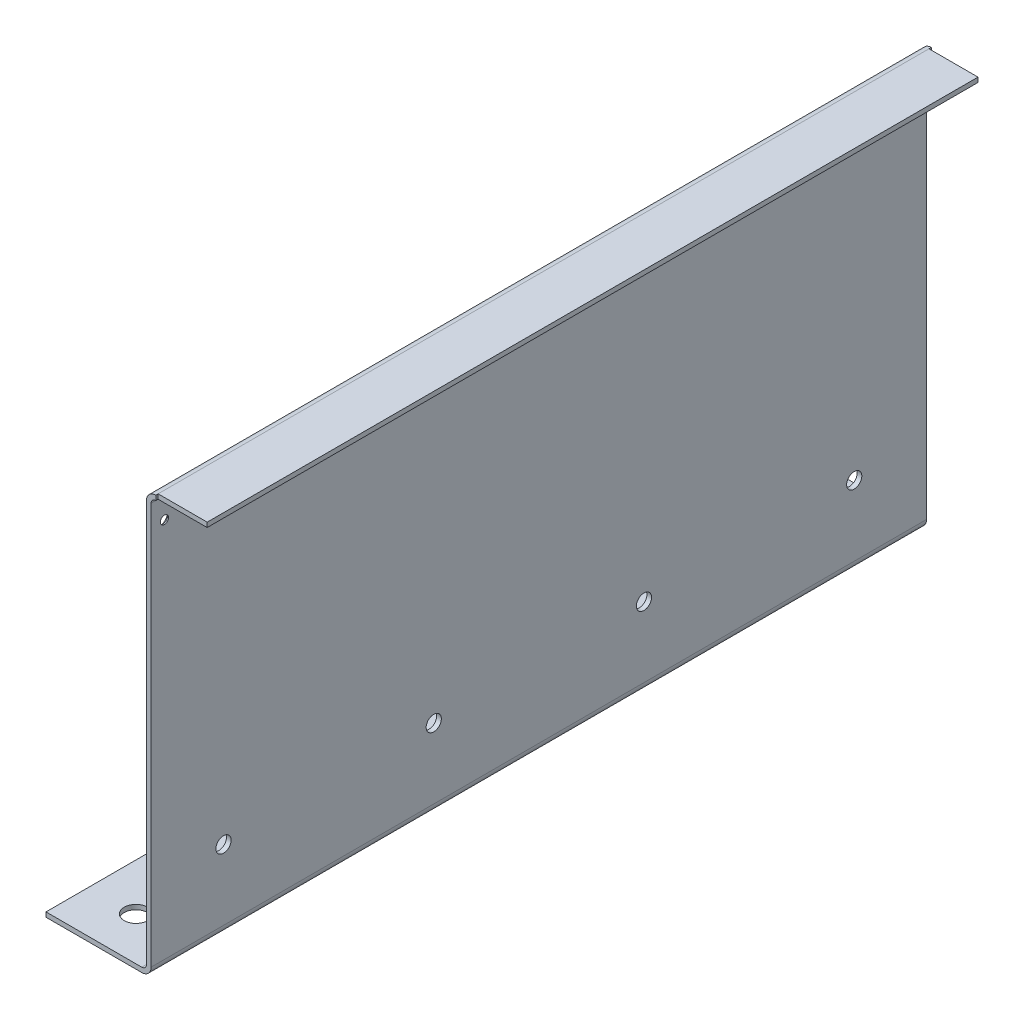
ISO-10303-21;
HEADER;
FILE_DESCRIPTION(('STEP AP214'),'2;1');
FILE_NAME('part.step','',(''),(''),'','','');
FILE_SCHEMA(('AUTOMOTIVE_DESIGN { 1 0 10303 214 1 1 1 1 }'));
ENDSEC;
DATA;
#1=APPLICATION_CONTEXT('core data for automotive mechanical design processes');
#2=APPLICATION_PROTOCOL_DEFINITION('international standard','automotive_design',2000,#1);
#3=PRODUCT_CONTEXT('',#1,'mechanical');
#4=PRODUCT('Part','Part','',(#3));
#5=PRODUCT_RELATED_PRODUCT_CATEGORY('part','',(#4));
#6=PRODUCT_DEFINITION_FORMATION('','',#4);
#7=PRODUCT_DEFINITION_CONTEXT('part definition',#1,'design');
#8=PRODUCT_DEFINITION('design','',#6,#7);
#9=PRODUCT_DEFINITION_SHAPE('','',#8);
#10=(LENGTH_UNIT() NAMED_UNIT(*) SI_UNIT(.MILLI.,.METRE.));
#11=(NAMED_UNIT(*) PLANE_ANGLE_UNIT() SI_UNIT($,.RADIAN.));
#12=(NAMED_UNIT(*) SI_UNIT($,.STERADIAN.) SOLID_ANGLE_UNIT());
#13=UNCERTAINTY_MEASURE_WITH_UNIT(LENGTH_MEASURE(1.E-05),#10,'distance_accuracy_value','');
#14=(GEOMETRIC_REPRESENTATION_CONTEXT(3) GLOBAL_UNCERTAINTY_ASSIGNED_CONTEXT((#13)) GLOBAL_UNIT_ASSIGNED_CONTEXT((#10,
#11,#12)) REPRESENTATION_CONTEXT('',''));
#15=CARTESIAN_POINT('',(0.,0.,0.));
#16=DIRECTION('',(0.,0.,1.));
#17=DIRECTION('',(1.,0.,0.));
#18=AXIS2_PLACEMENT_3D('',#15,#16,#17);
#19=CARTESIAN_POINT('',(3.00000000000004,104.,332.));
#20=DIRECTION('',(0.,0.,-1.));
#21=DIRECTION('',(-1.,0.,0.));
#22=AXIS2_PLACEMENT_3D('',#19,#20,#21);
#23=CYLINDRICAL_SURFACE('',#22,2.);
#24=CARTESIAN_POINT('',(3.00000000000004,104.,0.));
#25=DIRECTION('',(0.,0.,-1.));
#26=DIRECTION('',(1.,0.,0.));
#27=AXIS2_PLACEMENT_3D('',#24,#25,#26);
#28=CIRCLE('',#27,2.);
#29=CARTESIAN_POINT('',(1.00000000000004,104.,0.));
#30=VERTEX_POINT('',#29);
#31=CARTESIAN_POINT('',(3.00000000000004,106.,0.));
#32=VERTEX_POINT('',#31);
#33=EDGE_CURVE('E140',#30,#32,#28,.T.);
#34=ORIENTED_EDGE('',*,*,#33,.T.);
#35=DIRECTION('',(0.,0.,1.));
#36=VECTOR('',#35,1.);
#37=CARTESIAN_POINT('',(2.99999999999996,106.,332.));
#38=LINE('',#37,#36);
#39=CARTESIAN_POINT('',(2.99999999999996,106.,1.));
#40=VERTEX_POINT('',#39);
#41=EDGE_CURVE('E466',#32,#40,#38,.T.);
#42=ORIENTED_EDGE('',*,*,#41,.T.);
#43=DIRECTION('',(0.,0.,-1.));
#44=VECTOR('',#43,1.);
#45=CARTESIAN_POINT('',(3.00000000000004,106.,332.));
#46=LINE('',#45,#44);
#47=CARTESIAN_POINT('',(2.99999999999991,106.,331.));
#48=VERTEX_POINT('',#47);
#49=EDGE_CURVE('E181',#48,#40,#46,.T.);
#50=ORIENTED_EDGE('',*,*,#49,.F.);
#51=CARTESIAN_POINT('',(2.99999999999991,106.,332.));
#52=VERTEX_POINT('',#51);
#53=EDGE_CURVE('E182',#52,#48,#46,.T.);
#54=ORIENTED_EDGE('',*,*,#53,.F.);
#55=CARTESIAN_POINT('',(3.00000000000004,104.,332.));
#56=DIRECTION('',(0.,0.,-1.));
#57=DIRECTION('',(1.,0.,0.));
#58=AXIS2_PLACEMENT_3D('',#55,#56,#57);
#59=CIRCLE('',#58,2.);
#60=CARTESIAN_POINT('',(1.00000000000004,104.,332.));
#61=VERTEX_POINT('',#60);
#62=EDGE_CURVE('E157',#61,#52,#59,.T.);
#63=ORIENTED_EDGE('',*,*,#62,.F.);
#64=DIRECTION('',(0.,0.,-1.));
#65=VECTOR('',#64,1.);
#66=CARTESIAN_POINT('',(1.00000000000004,104.,332.));
#67=LINE('',#66,#65);
#68=EDGE_CURVE('E136',#61,#30,#67,.T.);
#69=ORIENTED_EDGE('',*,*,#68,.T.);
#70=EDGE_LOOP('',(#34,#42,#50,#54,#63,#69));
#71=FACE_BOUND('',#70,.T.);
#72=ADVANCED_FACE('F31',(#71),#23,.F.);
#73=CARTESIAN_POINT('',(3.00000000000004,106.,332.));
#74=DIRECTION('',(0.,1.,0.));
#75=DIRECTION('',(0.,0.,1.));
#76=AXIS2_PLACEMENT_3D('',#73,#74,#75);
#77=PLANE('',#76);
#78=DIRECTION('',(0.,0.,-1.));
#79=VECTOR('',#78,1.);
#80=CARTESIAN_POINT('',(23.9999999999997,106.,332.));
#81=LINE('',#80,#79);
#82=CARTESIAN_POINT('',(23.9999999999997,106.,331.));
#83=VERTEX_POINT('',#82);
#84=CARTESIAN_POINT('',(23.9999999999997,106.,1.));
#85=VERTEX_POINT('',#84);
#86=EDGE_CURVE('E178',#83,#85,#81,.T.);
#87=ORIENTED_EDGE('',*,*,#86,.F.);
#88=DIRECTION('',(-1.,0.,0.));
#89=VECTOR('',#88,1.);
#90=CARTESIAN_POINT('',(3.00000000000004,106.,331.));
#91=LINE('',#90,#89);
#92=EDGE_CURVE('E478',#83,#48,#91,.T.);
#93=ORIENTED_EDGE('',*,*,#92,.T.);
#94=ORIENTED_EDGE('',*,*,#49,.T.);
#95=DIRECTION('',(1.,0.,0.));
#96=VECTOR('',#95,1.);
#97=CARTESIAN_POINT('',(3.00000000000003,106.,1.));
#98=LINE('',#97,#96);
#99=EDGE_CURVE('E460',#40,#85,#98,.T.);
#100=ORIENTED_EDGE('',*,*,#99,.T.);
#101=EDGE_LOOP('',(#87,#93,#94,#100));
#102=FACE_BOUND('',#101,.T.);
#103=ADVANCED_FACE('F275',(#102),#77,.F.);
#104=CARTESIAN_POINT('',(23.9999999999997,108.,332.));
#105=DIRECTION('',(-1.,0.,0.));
#106=DIRECTION('',(0.,0.,1.));
#107=AXIS2_PLACEMENT_3D('',#104,#105,#106);
#108=PLANE('',#107);
#109=DIRECTION('',(0.,0.,-1.));
#110=VECTOR('',#109,1.);
#111=CARTESIAN_POINT('',(23.9999999999997,108.,332.));
#112=LINE('',#111,#110);
#113=CARTESIAN_POINT('',(23.9999999999997,108.,331.));
#114=VERTEX_POINT('',#113);
#115=CARTESIAN_POINT('',(23.9999999999997,108.,1.));
#116=VERTEX_POINT('',#115);
#117=EDGE_CURVE('E175',#114,#116,#112,.T.);
#118=ORIENTED_EDGE('',*,*,#117,.F.);
#119=DIRECTION('',(0.,-1.,0.));
#120=VECTOR('',#119,1.);
#121=CARTESIAN_POINT('',(23.9999999999997,108.,331.));
#122=LINE('',#121,#120);
#123=EDGE_CURVE('E481',#114,#83,#122,.T.);
#124=ORIENTED_EDGE('',*,*,#123,.T.);
#125=ORIENTED_EDGE('',*,*,#86,.T.);
#126=DIRECTION('',(0.,1.,0.));
#127=VECTOR('',#126,1.);
#128=CARTESIAN_POINT('',(23.9999999999997,108.,1.));
#129=LINE('',#128,#127);
#130=EDGE_CURVE('E463',#85,#116,#129,.T.);
#131=ORIENTED_EDGE('',*,*,#130,.T.);
#132=EDGE_LOOP('',(#118,#124,#125,#131));
#133=FACE_BOUND('',#132,.T.);
#134=ADVANCED_FACE('F281',(#133),#108,.F.);
#135=CARTESIAN_POINT('',(2.99999999999996,108.,332.));
#136=DIRECTION('',(0.,-1.,0.));
#137=DIRECTION('',(0.,0.,-1.));
#138=AXIS2_PLACEMENT_3D('',#135,#136,#137);
#139=PLANE('',#138);
#140=DIRECTION('',(0.,0.,-1.));
#141=VECTOR('',#140,1.);
#142=CARTESIAN_POINT('',(2.99999999999996,108.,332.));
#143=LINE('',#142,#141);
#144=CARTESIAN_POINT('',(2.99999999999991,108.,331.));
#145=VERTEX_POINT('',#144);
#146=CARTESIAN_POINT('',(2.99999999999996,108.,1.));
#147=VERTEX_POINT('',#146);
#148=EDGE_CURVE('E173',#145,#147,#143,.T.);
#149=ORIENTED_EDGE('',*,*,#148,.F.);
#150=DIRECTION('',(-1.,0.,0.));
#151=VECTOR('',#150,1.);
#152=CARTESIAN_POINT('',(2.99999999999991,108.,331.));
#153=LINE('',#152,#151);
#154=EDGE_CURVE('E217',#114,#145,#153,.T.);
#155=ORIENTED_EDGE('',*,*,#154,.F.);
#156=ORIENTED_EDGE('',*,*,#117,.T.);
#157=DIRECTION('',(1.,0.,0.));
#158=VECTOR('',#157,1.);
#159=CARTESIAN_POINT('',(2.99999999999996,108.,1.));
#160=LINE('',#159,#158);
#161=EDGE_CURVE('E472',#147,#116,#160,.T.);
#162=ORIENTED_EDGE('',*,*,#161,.F.);
#163=EDGE_LOOP('',(#149,#155,#156,#162));
#164=FACE_BOUND('',#163,.T.);
#165=ADVANCED_FACE('F287',(#164),#139,.F.);
#166=CARTESIAN_POINT('',(2.99999999999996,104.,332.));
#167=DIRECTION('',(0.,0.,-1.));
#168=DIRECTION('',(-1.,0.,0.));
#169=AXIS2_PLACEMENT_3D('',#166,#167,#168);
#170=CYLINDRICAL_SURFACE('',#169,4.);
#171=CARTESIAN_POINT('',(2.99999999999996,104.,0.));
#172=DIRECTION('',(0.,0.,1.));
#173=DIRECTION('',(-1.,0.,0.));
#174=AXIS2_PLACEMENT_3D('',#171,#172,#173);
#175=CIRCLE('',#174,4.);
#176=CARTESIAN_POINT('',(2.99999999999996,108.,0.));
#177=VERTEX_POINT('',#176);
#178=CARTESIAN_POINT('',(-1.00000000000004,104.,0.));
#179=VERTEX_POINT('',#178);
#180=EDGE_CURVE('E143',#177,#179,#175,.T.);
#181=ORIENTED_EDGE('',*,*,#180,.T.);
#182=DIRECTION('',(0.,0.,-1.));
#183=VECTOR('',#182,1.);
#184=CARTESIAN_POINT('',(-1.00000000000004,104.,332.));
#185=LINE('',#184,#183);
#186=CARTESIAN_POINT('',(-1.00000000000004,104.,332.));
#187=VERTEX_POINT('',#186);
#188=EDGE_CURVE('E170',#187,#179,#185,.T.);
#189=ORIENTED_EDGE('',*,*,#188,.F.);
#190=CARTESIAN_POINT('',(2.99999999999996,104.,332.));
#191=DIRECTION('',(0.,0.,1.));
#192=DIRECTION('',(-1.,0.,0.));
#193=AXIS2_PLACEMENT_3D('',#190,#191,#192);
#194=CIRCLE('',#193,4.);
#195=CARTESIAN_POINT('',(2.99999999999996,108.,332.));
#196=VERTEX_POINT('',#195);
#197=EDGE_CURVE('E449',#196,#187,#194,.T.);
#198=ORIENTED_EDGE('',*,*,#197,.F.);
#199=EDGE_CURVE('E96',#196,#145,#143,.T.);
#200=ORIENTED_EDGE('',*,*,#199,.T.);
#201=ORIENTED_EDGE('',*,*,#148,.T.);
#202=DIRECTION('',(0.,0.,1.));
#203=VECTOR('',#202,1.);
#204=CARTESIAN_POINT('',(2.99999999999996,108.,1.));
#205=LINE('',#204,#203);
#206=EDGE_CURVE('E475',#177,#147,#205,.T.);
#207=ORIENTED_EDGE('',*,*,#206,.F.);
#208=EDGE_LOOP('',(#181,#189,#198,#200,#201,#207));
#209=FACE_BOUND('',#208,.T.);
#210=ADVANCED_FACE('F291',(#209),#170,.T.);
#211=CARTESIAN_POINT('',(-1.,-67.9999999999999,332.));
#212=DIRECTION('',(1.,0.,0.));
#213=DIRECTION('',(0.,1.,0.));
#214=AXIS2_PLACEMENT_3D('',#211,#212,#213);
#215=PLANE('',#214);
#216=CARTESIAN_POINT('',(-1.00000000000004,95.,326.3));
#217=DIRECTION('',(1.,0.,0.));
#218=DIRECTION('',(0.,1.,0.));
#219=AXIS2_PLACEMENT_3D('',#216,#217,#218);
#220=CIRCLE('',#219,3.24999999999989);
#221=CARTESIAN_POINT('',(-1.00000000000004,98.2499999999999,326.3));
#222=VERTEX_POINT('',#221);
#223=EDGE_CURVE('E40',#222,#222,#220,.T.);
#224=ORIENTED_EDGE('',*,*,#223,.T.);
#225=EDGE_LOOP('',(#224));
#226=FACE_BOUND('',#225,.T.);
#227=CARTESIAN_POINT('',(-1.00000000000004,95.,5.7));
#228=DIRECTION('',(1.,0.,0.));
#229=DIRECTION('',(0.,1.,0.));
#230=AXIS2_PLACEMENT_3D('',#227,#228,#229);
#231=CIRCLE('',#230,3.25000000000003);
#232=CARTESIAN_POINT('',(-1.00000000000004,98.25,5.7));
#233=VERTEX_POINT('',#232);
#234=EDGE_CURVE('E223',#233,#233,#231,.T.);
#235=ORIENTED_EDGE('',*,*,#234,.T.);
#236=EDGE_LOOP('',(#235));
#237=FACE_BOUND('',#236,.T.);
#238=CARTESIAN_POINT('',(-1.00000000000002,-37.9999999999999,301.));
#239=DIRECTION('',(-1.,0.,0.));
#240=DIRECTION('',(0.,0.,1.));
#241=AXIS2_PLACEMENT_3D('',#238,#239,#240);
#242=CIRCLE('',#241,3.24999999999995);
#243=CARTESIAN_POINT('',(-1.00000000000002,-37.9999999999999,304.25));
#244=VERTEX_POINT('',#243);
#245=EDGE_CURVE('E200',#244,#244,#242,.T.);
#246=ORIENTED_EDGE('',*,*,#245,.F.);
#247=EDGE_LOOP('',(#246));
#248=FACE_BOUND('',#247,.T.);
#249=CARTESIAN_POINT('',(-1.00000000000002,-38.,211.));
#250=DIRECTION('',(-1.,0.,0.));
#251=DIRECTION('',(0.,0.,1.));
#252=AXIS2_PLACEMENT_3D('',#249,#250,#251);
#253=CIRCLE('',#252,3.25000000000001);
#254=CARTESIAN_POINT('',(-1.00000000000002,-38.,214.25));
#255=VERTEX_POINT('',#254);
#256=EDGE_CURVE('E196',#255,#255,#253,.T.);
#257=ORIENTED_EDGE('',*,*,#256,.F.);
#258=EDGE_LOOP('',(#257));
#259=FACE_BOUND('',#258,.T.);
#260=CARTESIAN_POINT('',(-1.00000000000002,-38.,121.));
#261=DIRECTION('',(-1.,0.,0.));
#262=DIRECTION('',(0.,0.,1.));
#263=AXIS2_PLACEMENT_3D('',#260,#261,#262);
#264=CIRCLE('',#263,3.25000000000001);
#265=CARTESIAN_POINT('',(-1.00000000000002,-38.,124.25));
#266=VERTEX_POINT('',#265);
#267=EDGE_CURVE('E192',#266,#266,#264,.T.);
#268=ORIENTED_EDGE('',*,*,#267,.F.);
#269=EDGE_LOOP('',(#268));
#270=FACE_BOUND('',#269,.T.);
#271=CARTESIAN_POINT('',(-1.00000000000002,-38.,31.));
#272=DIRECTION('',(-1.,0.,0.));
#273=DIRECTION('',(0.,0.,1.));
#274=AXIS2_PLACEMENT_3D('',#271,#272,#273);
#275=CIRCLE('',#274,3.25);
#276=CARTESIAN_POINT('',(-1.00000000000002,-38.,34.25));
#277=VERTEX_POINT('',#276);
#278=EDGE_CURVE('E188',#277,#277,#275,.T.);
#279=ORIENTED_EDGE('',*,*,#278,.F.);
#280=EDGE_LOOP('',(#279));
#281=FACE_BOUND('',#280,.T.);
#282=DIRECTION('',(0.,-1.,0.));
#283=VECTOR('',#282,1.);
#284=CARTESIAN_POINT('',(-1.,-67.9999999999999,0.));
#285=LINE('',#284,#283);
#286=CARTESIAN_POINT('',(-1.,-67.9999999999999,0.));
#287=VERTEX_POINT('',#286);
#288=EDGE_CURVE('E146',#179,#287,#285,.T.);
#289=ORIENTED_EDGE('',*,*,#288,.T.);
#290=DIRECTION('',(0.,0.,-1.));
#291=VECTOR('',#290,1.);
#292=CARTESIAN_POINT('',(-1.,-67.9999999999999,332.));
#293=LINE('',#292,#291);
#294=CARTESIAN_POINT('',(-1.,-67.9999999999999,332.));
#295=VERTEX_POINT('',#294);
#296=EDGE_CURVE('E167',#295,#287,#293,.T.);
#297=ORIENTED_EDGE('',*,*,#296,.F.);
#298=DIRECTION('',(0.,-1.,0.));
#299=VECTOR('',#298,1.);
#300=CARTESIAN_POINT('',(-1.,-67.9999999999999,332.));
#301=LINE('',#300,#299);
#302=EDGE_CURVE('E447',#187,#295,#301,.T.);
#303=ORIENTED_EDGE('',*,*,#302,.F.);
#304=ORIENTED_EDGE('',*,*,#188,.T.);
#305=EDGE_LOOP('',(#289,#297,#303,#304));
#306=FACE_BOUND('',#305,.T.);
#307=ADVANCED_FACE('F228',(#226,#237,#248,#259,#270,#281,#306),#215,.F.);
#308=CARTESIAN_POINT('',(-3.,-68.,332.));
#309=DIRECTION('',(0.,0.,-1.));
#310=DIRECTION('',(-1.,0.,0.));
#311=AXIS2_PLACEMENT_3D('',#308,#309,#310);
#312=CYLINDRICAL_SURFACE('',#311,2.00000000000001);
#313=CARTESIAN_POINT('',(-3.,-68.,0.));
#314=DIRECTION('',(0.,0.,-1.));
#315=DIRECTION('',(1.,0.,0.));
#316=AXIS2_PLACEMENT_3D('',#313,#314,#315);
#317=CIRCLE('',#316,2.00000000000001);
#318=CARTESIAN_POINT('',(-3.,-70.,0.));
#319=VERTEX_POINT('',#318);
#320=EDGE_CURVE('E148',#287,#319,#317,.T.);
#321=ORIENTED_EDGE('',*,*,#320,.T.);
#322=DIRECTION('',(0.,0.,-1.));
#323=VECTOR('',#322,1.);
#324=CARTESIAN_POINT('',(-3.,-70.,332.));
#325=LINE('',#324,#323);
#326=CARTESIAN_POINT('',(-3.,-70.,332.));
#327=VERTEX_POINT('',#326);
#328=EDGE_CURVE('E164',#327,#319,#325,.T.);
#329=ORIENTED_EDGE('',*,*,#328,.F.);
#330=CARTESIAN_POINT('',(-3.,-68.,332.));
#331=DIRECTION('',(0.,0.,-1.));
#332=DIRECTION('',(1.,0.,0.));
#333=AXIS2_PLACEMENT_3D('',#330,#331,#332);
#334=CIRCLE('',#333,2.00000000000001);
#335=EDGE_CURVE('E437',#295,#327,#334,.T.);
#336=ORIENTED_EDGE('',*,*,#335,.F.);
#337=ORIENTED_EDGE('',*,*,#296,.T.);
#338=EDGE_LOOP('',(#321,#329,#336,#337));
#339=FACE_BOUND('',#338,.T.);
#340=ADVANCED_FACE('F298',(#339),#312,.F.);
#341=CARTESIAN_POINT('',(-3.,-70.,332.));
#342=DIRECTION('',(0.,-1.,0.));
#343=DIRECTION('',(1.,0.,0.));
#344=AXIS2_PLACEMENT_3D('',#341,#342,#343);
#345=PLANE('',#344);
#346=CARTESIAN_POINT('',(-24.,-70.,313.5));
#347=DIRECTION('',(0.,1.,0.));
#348=DIRECTION('',(0.,0.,1.));
#349=AXIS2_PLACEMENT_3D('',#346,#347,#348);
#350=CIRCLE('',#349,5.);
#351=CARTESIAN_POINT('',(-24.,-70.,318.5));
#352=VERTEX_POINT('',#351);
#353=EDGE_CURVE('E208',#352,#352,#350,.T.);
#354=ORIENTED_EDGE('',*,*,#353,.F.);
#355=EDGE_LOOP('',(#354));
#356=FACE_BOUND('',#355,.T.);
#357=CARTESIAN_POINT('',(-24.,-70.,18.5));
#358=DIRECTION('',(0.,1.,0.));
#359=DIRECTION('',(0.,0.,1.));
#360=AXIS2_PLACEMENT_3D('',#357,#358,#359);
#361=CIRCLE('',#360,5.);
#362=CARTESIAN_POINT('',(-24.,-70.,23.5));
#363=VERTEX_POINT('',#362);
#364=EDGE_CURVE('E204',#363,#363,#361,.T.);
#365=ORIENTED_EDGE('',*,*,#364,.F.);
#366=EDGE_LOOP('',(#365));
#367=FACE_BOUND('',#366,.T.);
#368=DIRECTION('',(-1.,0.,0.));
#369=VECTOR('',#368,1.);
#370=CARTESIAN_POINT('',(-3.,-70.,0.));
#371=LINE('',#370,#369);
#372=CARTESIAN_POINT('',(-44.,-70.,0.));
#373=VERTEX_POINT('',#372);
#374=EDGE_CURVE('E150',#319,#373,#371,.T.);
#375=ORIENTED_EDGE('',*,*,#374,.T.);
#376=DIRECTION('',(0.,0.,-1.));
#377=VECTOR('',#376,1.);
#378=CARTESIAN_POINT('',(-44.,-70.,332.));
#379=LINE('',#378,#377);
#380=CARTESIAN_POINT('',(-44.,-70.,332.));
#381=VERTEX_POINT('',#380);
#382=EDGE_CURVE('E161',#381,#373,#379,.T.);
#383=ORIENTED_EDGE('',*,*,#382,.F.);
#384=DIRECTION('',(-1.,0.,0.));
#385=VECTOR('',#384,1.);
#386=CARTESIAN_POINT('',(-3.,-70.,332.));
#387=LINE('',#386,#385);
#388=EDGE_CURVE('E443',#327,#381,#387,.T.);
#389=ORIENTED_EDGE('',*,*,#388,.F.);
#390=ORIENTED_EDGE('',*,*,#328,.T.);
#391=EDGE_LOOP('',(#375,#383,#389,#390));
#392=FACE_BOUND('',#391,.T.);
#393=ADVANCED_FACE('F301',(#356,#367,#392),#345,.F.);
#394=CARTESIAN_POINT('',(-44.,-72.,332.));
#395=DIRECTION('',(1.,0.,0.));
#396=DIRECTION('',(0.,1.,0.));
#397=AXIS2_PLACEMENT_3D('',#394,#395,#396);
#398=PLANE('',#397);
#399=DIRECTION('',(0.,-1.,0.));
#400=VECTOR('',#399,1.);
#401=CARTESIAN_POINT('',(-44.,-72.,0.));
#402=LINE('',#401,#400);
#403=CARTESIAN_POINT('',(-44.,-72.,0.));
#404=VERTEX_POINT('',#403);
#405=EDGE_CURVE('E152',#373,#404,#402,.T.);
#406=ORIENTED_EDGE('',*,*,#405,.T.);
#407=DIRECTION('',(0.,0.,-1.));
#408=VECTOR('',#407,1.);
#409=CARTESIAN_POINT('',(-44.,-72.,332.));
#410=LINE('',#409,#408);
#411=CARTESIAN_POINT('',(-44.,-72.,332.));
#412=VERTEX_POINT('',#411);
#413=EDGE_CURVE('E131',#412,#404,#410,.T.);
#414=ORIENTED_EDGE('',*,*,#413,.F.);
#415=DIRECTION('',(0.,-1.,0.));
#416=VECTOR('',#415,1.);
#417=CARTESIAN_POINT('',(-44.,-72.,332.));
#418=LINE('',#417,#416);
#419=EDGE_CURVE('E122',#381,#412,#418,.T.);
#420=ORIENTED_EDGE('',*,*,#419,.F.);
#421=ORIENTED_EDGE('',*,*,#382,.T.);
#422=EDGE_LOOP('',(#406,#414,#420,#421));
#423=FACE_BOUND('',#422,.T.);
#424=ADVANCED_FACE('F305',(#423),#398,.F.);
#425=CARTESIAN_POINT('',(-3.,-72.,332.));
#426=DIRECTION('',(0.,1.,0.));
#427=DIRECTION('',(0.,0.,1.));
#428=AXIS2_PLACEMENT_3D('',#425,#426,#427);
#429=PLANE('',#428);
#430=CARTESIAN_POINT('',(-24.,-72.,313.5));
#431=DIRECTION('',(0.,1.,0.));
#432=DIRECTION('',(0.,0.,1.));
#433=AXIS2_PLACEMENT_3D('',#430,#431,#432);
#434=CIRCLE('',#433,5.);
#435=CARTESIAN_POINT('',(-24.,-72.,318.5));
#436=VERTEX_POINT('',#435);
#437=EDGE_CURVE('E205',#436,#436,#434,.T.);
#438=ORIENTED_EDGE('',*,*,#437,.T.);
#439=EDGE_LOOP('',(#438));
#440=FACE_BOUND('',#439,.T.);
#441=CARTESIAN_POINT('',(-24.,-72.,18.5));
#442=DIRECTION('',(0.,1.,0.));
#443=DIRECTION('',(0.,0.,1.));
#444=AXIS2_PLACEMENT_3D('',#441,#442,#443);
#445=CIRCLE('',#444,5.);
#446=CARTESIAN_POINT('',(-24.,-72.,23.5));
#447=VERTEX_POINT('',#446);
#448=EDGE_CURVE('E201',#447,#447,#445,.T.);
#449=ORIENTED_EDGE('',*,*,#448,.T.);
#450=EDGE_LOOP('',(#449));
#451=FACE_BOUND('',#450,.T.);
#452=DIRECTION('',(1.,0.,0.));
#453=VECTOR('',#452,1.);
#454=CARTESIAN_POINT('',(-3.,-72.,0.));
#455=LINE('',#454,#453);
#456=CARTESIAN_POINT('',(-3.,-72.,0.));
#457=VERTEX_POINT('',#456);
#458=EDGE_CURVE('E130',#404,#457,#455,.T.);
#459=ORIENTED_EDGE('',*,*,#458,.T.);
#460=DIRECTION('',(0.,0.,-1.));
#461=VECTOR('',#460,1.);
#462=CARTESIAN_POINT('',(-3.,-72.,332.));
#463=LINE('',#462,#461);
#464=CARTESIAN_POINT('',(-3.,-72.,332.));
#465=VERTEX_POINT('',#464);
#466=EDGE_CURVE('E127',#465,#457,#463,.T.);
#467=ORIENTED_EDGE('',*,*,#466,.F.);
#468=DIRECTION('',(1.,0.,0.));
#469=VECTOR('',#468,1.);
#470=CARTESIAN_POINT('',(-3.,-72.,332.));
#471=LINE('',#470,#469);
#472=EDGE_CURVE('E116',#412,#465,#471,.T.);
#473=ORIENTED_EDGE('',*,*,#472,.F.);
#474=ORIENTED_EDGE('',*,*,#413,.T.);
#475=EDGE_LOOP('',(#459,#467,#473,#474));
#476=FACE_BOUND('',#475,.T.);
#477=ADVANCED_FACE('F128',(#440,#451,#476),#429,.F.);
#478=CARTESIAN_POINT('',(-3.,-68.,332.));
#479=DIRECTION('',(0.,0.,-1.));
#480=DIRECTION('',(-1.,0.,0.));
#481=AXIS2_PLACEMENT_3D('',#478,#479,#480);
#482=CYLINDRICAL_SURFACE('',#481,4.);
#483=CARTESIAN_POINT('',(-3.,-68.,0.));
#484=DIRECTION('',(0.,0.,1.));
#485=DIRECTION('',(1.,0.,0.));
#486=AXIS2_PLACEMENT_3D('',#483,#484,#485);
#487=CIRCLE('',#486,4.);
#488=CARTESIAN_POINT('',(1.,-68.,0.));
#489=VERTEX_POINT('',#488);
#490=EDGE_CURVE('E81',#457,#489,#487,.T.);
#491=ORIENTED_EDGE('',*,*,#490,.T.);
#492=DIRECTION('',(0.,0.,-1.));
#493=VECTOR('',#492,1.);
#494=CARTESIAN_POINT('',(1.,-68.,332.));
#495=LINE('',#494,#493);
#496=CARTESIAN_POINT('',(1.,-68.,332.));
#497=VERTEX_POINT('',#496);
#498=EDGE_CURVE('E132',#497,#489,#495,.T.);
#499=ORIENTED_EDGE('',*,*,#498,.F.);
#500=CARTESIAN_POINT('',(-3.,-68.,332.));
#501=DIRECTION('',(0.,0.,1.));
#502=DIRECTION('',(1.,0.,0.));
#503=AXIS2_PLACEMENT_3D('',#500,#501,#502);
#504=CIRCLE('',#503,4.);
#505=EDGE_CURVE('E120',#465,#497,#504,.T.);
#506=ORIENTED_EDGE('',*,*,#505,.F.);
#507=ORIENTED_EDGE('',*,*,#466,.T.);
#508=EDGE_LOOP('',(#491,#499,#506,#507));
#509=FACE_BOUND('',#508,.T.);
#510=ADVANCED_FACE('F134',(#509),#482,.T.);
#511=CARTESIAN_POINT('',(1.,-68.,332.));
#512=DIRECTION('',(-1.,0.,0.));
#513=DIRECTION('',(0.,-1.,0.));
#514=AXIS2_PLACEMENT_3D('',#511,#512,#513);
#515=PLANE('',#514);
#516=CARTESIAN_POINT('',(1.00000000000004,95.,326.3));
#517=DIRECTION('',(-1.,0.,0.));
#518=DIRECTION('',(0.,-1.,0.));
#519=AXIS2_PLACEMENT_3D('',#516,#517,#518);
#520=CIRCLE('',#519,1.74999999999992);
#521=CARTESIAN_POINT('',(1.00000000000004,93.2500000000001,326.3));
#522=VERTEX_POINT('',#521);
#523=EDGE_CURVE('E218',#522,#522,#520,.T.);
#524=ORIENTED_EDGE('',*,*,#523,.T.);
#525=EDGE_LOOP('',(#524));
#526=FACE_BOUND('',#525,.T.);
#527=CARTESIAN_POINT('',(1.00000000000004,95.,5.7));
#528=DIRECTION('',(-1.,0.,0.));
#529=DIRECTION('',(0.,-1.,0.));
#530=AXIS2_PLACEMENT_3D('',#527,#528,#529);
#531=CIRCLE('',#530,1.75);
#532=CARTESIAN_POINT('',(1.00000000000004,93.25,5.7));
#533=VERTEX_POINT('',#532);
#534=EDGE_CURVE('E214',#533,#533,#531,.T.);
#535=ORIENTED_EDGE('',*,*,#534,.T.);
#536=EDGE_LOOP('',(#535));
#537=FACE_BOUND('',#536,.T.);
#538=CARTESIAN_POINT('',(1.00000000000001,-37.9999999999999,301.));
#539=DIRECTION('',(-1.,0.,0.));
#540=DIRECTION('',(0.,-1.,0.));
#541=AXIS2_PLACEMENT_3D('',#538,#539,#540);
#542=CIRCLE('',#541,3.24999999999995);
#543=CARTESIAN_POINT('',(1.00000000000001,-41.2499999999999,301.));
#544=VERTEX_POINT('',#543);
#545=EDGE_CURVE('E197',#544,#544,#542,.T.);
#546=ORIENTED_EDGE('',*,*,#545,.T.);
#547=EDGE_LOOP('',(#546));
#548=FACE_BOUND('',#547,.T.);
#549=CARTESIAN_POINT('',(1.00000000000001,-38.,211.));
#550=DIRECTION('',(-1.,0.,0.));
#551=DIRECTION('',(0.,-1.,0.));
#552=AXIS2_PLACEMENT_3D('',#549,#550,#551);
#553=CIRCLE('',#552,3.25000000000001);
#554=CARTESIAN_POINT('',(1.00000000000001,-41.25,211.));
#555=VERTEX_POINT('',#554);
#556=EDGE_CURVE('E193',#555,#555,#553,.T.);
#557=ORIENTED_EDGE('',*,*,#556,.T.);
#558=EDGE_LOOP('',(#557));
#559=FACE_BOUND('',#558,.T.);
#560=CARTESIAN_POINT('',(1.00000000000001,-38.,121.));
#561=DIRECTION('',(-1.,0.,0.));
#562=DIRECTION('',(0.,-1.,0.));
#563=AXIS2_PLACEMENT_3D('',#560,#561,#562);
#564=CIRCLE('',#563,3.25000000000001);
#565=CARTESIAN_POINT('',(1.00000000000001,-41.25,121.));
#566=VERTEX_POINT('',#565);
#567=EDGE_CURVE('E189',#566,#566,#564,.T.);
#568=ORIENTED_EDGE('',*,*,#567,.T.);
#569=EDGE_LOOP('',(#568));
#570=FACE_BOUND('',#569,.T.);
#571=CARTESIAN_POINT('',(1.00000000000001,-38.,31.));
#572=DIRECTION('',(-1.,0.,0.));
#573=DIRECTION('',(0.,-1.,0.));
#574=AXIS2_PLACEMENT_3D('',#571,#572,#573);
#575=CIRCLE('',#574,3.25);
#576=CARTESIAN_POINT('',(1.00000000000001,-41.25,31.));
#577=VERTEX_POINT('',#576);
#578=EDGE_CURVE('E144',#577,#577,#575,.T.);
#579=ORIENTED_EDGE('',*,*,#578,.T.);
#580=EDGE_LOOP('',(#579));
#581=FACE_BOUND('',#580,.T.);
#582=DIRECTION('',(0.,1.,0.));
#583=VECTOR('',#582,1.);
#584=CARTESIAN_POINT('',(1.,-68.,0.));
#585=LINE('',#584,#583);
#586=EDGE_CURVE('E87',#489,#30,#585,.T.);
#587=ORIENTED_EDGE('',*,*,#586,.T.);
#588=ORIENTED_EDGE('',*,*,#68,.F.);
#589=DIRECTION('',(0.,1.,0.));
#590=VECTOR('',#589,1.);
#591=CARTESIAN_POINT('',(1.,-68.,332.));
#592=LINE('',#591,#590);
#593=EDGE_CURVE('E48',#497,#61,#592,.T.);
#594=ORIENTED_EDGE('',*,*,#593,.F.);
#595=ORIENTED_EDGE('',*,*,#498,.T.);
#596=EDGE_LOOP('',(#587,#588,#594,#595));
#597=FACE_BOUND('',#596,.T.);
#598=ADVANCED_FACE('F243',(#526,#537,#548,#559,#570,#581,#597),#515,.F.);
#599=CARTESIAN_POINT('',(3.00000000000004,104.,332.));
#600=DIRECTION('',(0.,0.,1.));
#601=DIRECTION('',(1.,0.,0.));
#602=AXIS2_PLACEMENT_3D('',#599,#600,#601);
#603=PLANE('',#602);
#604=DIRECTION('',(0.,-1.,0.));
#605=VECTOR('',#604,1.);
#606=CARTESIAN_POINT('',(2.99999999999991,104.,332.));
#607=LINE('',#606,#605);
#608=EDGE_CURVE('E211',#196,#52,#607,.T.);
#609=ORIENTED_EDGE('',*,*,#608,.F.);
#610=ORIENTED_EDGE('',*,*,#197,.T.);
#611=ORIENTED_EDGE('',*,*,#302,.T.);
#612=ORIENTED_EDGE('',*,*,#335,.T.);
#613=ORIENTED_EDGE('',*,*,#388,.T.);
#614=ORIENTED_EDGE('',*,*,#419,.T.);
#615=ORIENTED_EDGE('',*,*,#472,.T.);
#616=ORIENTED_EDGE('',*,*,#505,.T.);
#617=ORIENTED_EDGE('',*,*,#593,.T.);
#618=ORIENTED_EDGE('',*,*,#62,.T.);
#619=EDGE_LOOP('',(#609,#610,#611,#612,#613,#614,#615,#616,#617,#618));
#620=FACE_BOUND('',#619,.T.);
#621=ADVANCED_FACE('F118',(#620),#603,.T.);
#622=CARTESIAN_POINT('',(3.00000000000004,104.,0.));
#623=DIRECTION('',(0.,0.,1.));
#624=DIRECTION('',(1.,0.,0.));
#625=AXIS2_PLACEMENT_3D('',#622,#623,#624);
#626=PLANE('',#625);
#627=ORIENTED_EDGE('',*,*,#180,.F.);
#628=DIRECTION('',(0.,-1.,0.));
#629=VECTOR('',#628,1.);
#630=CARTESIAN_POINT('',(2.99999999999996,104.,0.));
#631=LINE('',#630,#629);
#632=EDGE_CURVE('E185',#177,#32,#631,.T.);
#633=ORIENTED_EDGE('',*,*,#632,.T.);
#634=ORIENTED_EDGE('',*,*,#33,.F.);
#635=ORIENTED_EDGE('',*,*,#586,.F.);
#636=ORIENTED_EDGE('',*,*,#490,.F.);
#637=ORIENTED_EDGE('',*,*,#458,.F.);
#638=ORIENTED_EDGE('',*,*,#405,.F.);
#639=ORIENTED_EDGE('',*,*,#374,.F.);
#640=ORIENTED_EDGE('',*,*,#320,.F.);
#641=ORIENTED_EDGE('',*,*,#288,.F.);
#642=EDGE_LOOP('',(#627,#633,#634,#635,#636,#637,#638,#639,#640,#641));
#643=FACE_BOUND('',#642,.T.);
#644=ADVANCED_FACE('F260',(#643),#626,.F.);
#645=CARTESIAN_POINT('',(3.99999999999998,-38.,31.));
#646=DIRECTION('',(-1.,0.,0.));
#647=DIRECTION('',(0.,0.,1.));
#648=AXIS2_PLACEMENT_3D('',#645,#646,#647);
#649=CYLINDRICAL_SURFACE('',#648,3.25);
#650=ORIENTED_EDGE('',*,*,#278,.T.);
#651=EDGE_LOOP('',(#650));
#652=FACE_BOUND('',#651,.T.);
#653=ORIENTED_EDGE('',*,*,#578,.F.);
#654=EDGE_LOOP('',(#653));
#655=FACE_BOUND('',#654,.T.);
#656=ADVANCED_FACE('F257',(#652,#655),#649,.F.);
#657=CARTESIAN_POINT('',(3.99999999999998,-38.,121.));
#658=DIRECTION('',(-1.,0.,0.));
#659=DIRECTION('',(0.,0.,1.));
#660=AXIS2_PLACEMENT_3D('',#657,#658,#659);
#661=CYLINDRICAL_SURFACE('',#660,3.25000000000001);
#662=ORIENTED_EDGE('',*,*,#267,.T.);
#663=EDGE_LOOP('',(#662));
#664=FACE_BOUND('',#663,.T.);
#665=ORIENTED_EDGE('',*,*,#567,.F.);
#666=EDGE_LOOP('',(#665));
#667=FACE_BOUND('',#666,.T.);
#668=ADVANCED_FACE('F259',(#664,#667),#661,.F.);
#669=CARTESIAN_POINT('',(3.99999999999998,-38.,211.));
#670=DIRECTION('',(-1.,0.,0.));
#671=DIRECTION('',(0.,0.,1.));
#672=AXIS2_PLACEMENT_3D('',#669,#670,#671);
#673=CYLINDRICAL_SURFACE('',#672,3.25000000000001);
#674=ORIENTED_EDGE('',*,*,#256,.T.);
#675=EDGE_LOOP('',(#674));
#676=FACE_BOUND('',#675,.T.);
#677=ORIENTED_EDGE('',*,*,#556,.F.);
#678=EDGE_LOOP('',(#677));
#679=FACE_BOUND('',#678,.T.);
#680=ADVANCED_FACE('F267',(#676,#679),#673,.F.);
#681=CARTESIAN_POINT('',(3.99999999999998,-37.9999999999999,301.));
#682=DIRECTION('',(-1.,0.,0.));
#683=DIRECTION('',(0.,0.,1.));
#684=AXIS2_PLACEMENT_3D('',#681,#682,#683);
#685=CYLINDRICAL_SURFACE('',#684,3.24999999999995);
#686=ORIENTED_EDGE('',*,*,#245,.T.);
#687=EDGE_LOOP('',(#686));
#688=FACE_BOUND('',#687,.T.);
#689=ORIENTED_EDGE('',*,*,#545,.F.);
#690=EDGE_LOOP('',(#689));
#691=FACE_BOUND('',#690,.T.);
#692=ADVANCED_FACE('F533',(#688,#691),#685,.F.);
#693=CARTESIAN_POINT('',(-24.,-75.,18.5));
#694=DIRECTION('',(0.,1.,0.));
#695=DIRECTION('',(0.,0.,1.));
#696=AXIS2_PLACEMENT_3D('',#693,#694,#695);
#697=CYLINDRICAL_SURFACE('',#696,5.);
#698=ORIENTED_EDGE('',*,*,#364,.T.);
#699=EDGE_LOOP('',(#698));
#700=FACE_BOUND('',#699,.T.);
#701=ORIENTED_EDGE('',*,*,#448,.F.);
#702=EDGE_LOOP('',(#701));
#703=FACE_BOUND('',#702,.T.);
#704=ADVANCED_FACE('F530',(#700,#703),#697,.F.);
#705=CARTESIAN_POINT('',(-24.,-75.,313.5));
#706=DIRECTION('',(0.,1.,0.));
#707=DIRECTION('',(0.,0.,1.));
#708=AXIS2_PLACEMENT_3D('',#705,#706,#707);
#709=CYLINDRICAL_SURFACE('',#708,5.);
#710=ORIENTED_EDGE('',*,*,#353,.T.);
#711=EDGE_LOOP('',(#710));
#712=FACE_BOUND('',#711,.T.);
#713=ORIENTED_EDGE('',*,*,#437,.F.);
#714=EDGE_LOOP('',(#713));
#715=FACE_BOUND('',#714,.T.);
#716=ADVANCED_FACE('F336',(#712,#715),#709,.F.);
#717=CARTESIAN_POINT('',(2.99999999999996,98.,1.));
#718=DIRECTION('',(0.,0.,1.));
#719=DIRECTION('',(1.,0.,0.));
#720=AXIS2_PLACEMENT_3D('',#717,#718,#719);
#721=PLANE('',#720);
#722=DIRECTION('',(0.,1.,0.));
#723=VECTOR('',#722,1.);
#724=CARTESIAN_POINT('',(2.99999999999996,98.,1.));
#725=LINE('',#724,#723);
#726=EDGE_CURVE('E469',#40,#147,#725,.T.);
#727=ORIENTED_EDGE('',*,*,#726,.T.);
#728=ORIENTED_EDGE('',*,*,#161,.T.);
#729=ORIENTED_EDGE('',*,*,#130,.F.);
#730=ORIENTED_EDGE('',*,*,#99,.F.);
#731=EDGE_LOOP('',(#727,#728,#729,#730));
#732=FACE_BOUND('',#731,.T.);
#733=ADVANCED_FACE('F330',(#732),#721,.F.);
#734=CARTESIAN_POINT('',(2.99999999999996,98.,1.));
#735=DIRECTION('',(-1.,0.,0.));
#736=DIRECTION('',(0.,0.,1.));
#737=AXIS2_PLACEMENT_3D('',#734,#735,#736);
#738=PLANE('',#737);
#739=ORIENTED_EDGE('',*,*,#632,.F.);
#740=ORIENTED_EDGE('',*,*,#206,.T.);
#741=ORIENTED_EDGE('',*,*,#726,.F.);
#742=ORIENTED_EDGE('',*,*,#41,.F.);
#743=EDGE_LOOP('',(#739,#740,#741,#742));
#744=FACE_BOUND('',#743,.T.);
#745=ADVANCED_FACE('F335',(#744),#738,.F.);
#746=CARTESIAN_POINT('',(2.99999999999991,98.,331.));
#747=DIRECTION('',(0.,0.,-1.));
#748=DIRECTION('',(-1.,0.,0.));
#749=AXIS2_PLACEMENT_3D('',#746,#747,#748);
#750=PLANE('',#749);
#751=ORIENTED_EDGE('',*,*,#123,.F.);
#752=ORIENTED_EDGE('',*,*,#154,.T.);
#753=DIRECTION('',(0.,1.,0.));
#754=VECTOR('',#753,1.);
#755=CARTESIAN_POINT('',(2.99999999999991,98.,331.));
#756=LINE('',#755,#754);
#757=EDGE_CURVE('E484',#48,#145,#756,.T.);
#758=ORIENTED_EDGE('',*,*,#757,.F.);
#759=ORIENTED_EDGE('',*,*,#92,.F.);
#760=EDGE_LOOP('',(#751,#752,#758,#759));
#761=FACE_BOUND('',#760,.T.);
#762=ADVANCED_FACE('F348',(#761),#750,.F.);
#763=CARTESIAN_POINT('',(2.99999999999991,98.,331.));
#764=DIRECTION('',(-1.,0.,0.));
#765=DIRECTION('',(0.,0.,1.));
#766=AXIS2_PLACEMENT_3D('',#763,#764,#765);
#767=PLANE('',#766);
#768=ORIENTED_EDGE('',*,*,#757,.T.);
#769=ORIENTED_EDGE('',*,*,#199,.F.);
#770=ORIENTED_EDGE('',*,*,#608,.T.);
#771=ORIENTED_EDGE('',*,*,#53,.T.);
#772=EDGE_LOOP('',(#768,#769,#770,#771));
#773=FACE_BOUND('',#772,.T.);
#774=ADVANCED_FACE('F358',(#773),#767,.F.);
#775=CARTESIAN_POINT('',(1.49999999999996,95.,5.7));
#776=DIRECTION('',(-1.,0.,0.));
#777=DIRECTION('',(0.,-1.,0.));
#778=AXIS2_PLACEMENT_3D('',#775,#776,#777);
#779=CYLINDRICAL_SURFACE('',#778,1.75);
#780=CARTESIAN_POINT('',(0.499999999999993,95.,5.7));
#781=DIRECTION('',(1.,0.,0.));
#782=DIRECTION('',(0.,0.,-1.));
#783=AXIS2_PLACEMENT_3D('',#780,#781,#782);
#784=CIRCLE('',#783,1.75);
#785=CARTESIAN_POINT('',(0.499999999999993,95.,3.95));
#786=VERTEX_POINT('',#785);
#787=EDGE_CURVE('E11',#786,#786,#784,.F.);
#788=ORIENTED_EDGE('',*,*,#787,.T.);
#789=EDGE_LOOP('',(#788));
#790=FACE_BOUND('',#789,.T.);
#791=ORIENTED_EDGE('',*,*,#534,.F.);
#792=EDGE_LOOP('',(#791));
#793=FACE_BOUND('',#792,.T.);
#794=ADVANCED_FACE('F239',(#790,#793),#779,.F.);
#795=CARTESIAN_POINT('',(1.49999999999996,95.,326.3));
#796=DIRECTION('',(-1.,0.,0.));
#797=DIRECTION('',(0.,-1.,0.));
#798=AXIS2_PLACEMENT_3D('',#795,#796,#797);
#799=CYLINDRICAL_SURFACE('',#798,1.74999999999992);
#800=CARTESIAN_POINT('',(0.499999999999906,95.,326.3));
#801=DIRECTION('',(1.,0.,0.));
#802=DIRECTION('',(0.,0.,-1.));
#803=AXIS2_PLACEMENT_3D('',#800,#801,#802);
#804=CIRCLE('',#803,1.74999999999992);
#805=CARTESIAN_POINT('',(0.499999999999906,95.,324.55));
#806=VERTEX_POINT('',#805);
#807=EDGE_CURVE('E213',#806,#806,#804,.F.);
#808=ORIENTED_EDGE('',*,*,#807,.T.);
#809=EDGE_LOOP('',(#808));
#810=FACE_BOUND('',#809,.T.);
#811=ORIENTED_EDGE('',*,*,#523,.F.);
#812=EDGE_LOOP('',(#811));
#813=FACE_BOUND('',#812,.T.);
#814=ADVANCED_FACE('F234',(#810,#813),#799,.F.);
#815=CARTESIAN_POINT('',(0.499999999999906,95.,326.3));
#816=DIRECTION('',(-1.,0.,0.));
#817=DIRECTION('',(0.,0.,1.));
#818=AXIS2_PLACEMENT_3D('',#815,#816,#817);
#819=CONICAL_SURFACE('',#818,1.74999999999992,0.785398163397456);
#820=ORIENTED_EDGE('',*,*,#223,.F.);
#821=EDGE_LOOP('',(#820));
#822=FACE_BOUND('',#821,.T.);
#823=ORIENTED_EDGE('',*,*,#807,.F.);
#824=EDGE_LOOP('',(#823));
#825=FACE_BOUND('',#824,.T.);
#826=ADVANCED_FACE('F231',(#822,#825),#819,.F.);
#827=CARTESIAN_POINT('',(0.499999999999994,95.,5.7));
#828=DIRECTION('',(-1.,0.,0.));
#829=DIRECTION('',(0.,0.,1.));
#830=AXIS2_PLACEMENT_3D('',#827,#828,#829);
#831=CONICAL_SURFACE('',#830,1.75,0.785398163397447);
#832=ORIENTED_EDGE('',*,*,#234,.F.);
#833=EDGE_LOOP('',(#832));
#834=FACE_BOUND('',#833,.T.);
#835=ORIENTED_EDGE('',*,*,#787,.F.);
#836=EDGE_LOOP('',(#835));
#837=FACE_BOUND('',#836,.T.);
#838=ADVANCED_FACE('F33',(#834,#837),#831,.F.);
#839=CLOSED_SHELL('',(#72,#103,#134,#165,#210,#307,#340,#393,#424,#477,#510,#598,#621,#644,#656,
#668,#680,#692,#704,#716,#733,#745,#762,#774,#794,#814,#826,#838));
#840=MANIFOLD_SOLID_BREP('B2',#839);
#841=ADVANCED_BREP_SHAPE_REPRESENTATION('',(#18,#840),#14);
#842=SHAPE_DEFINITION_REPRESENTATION(#9,#841);
ENDSEC;
END-ISO-10303-21;
